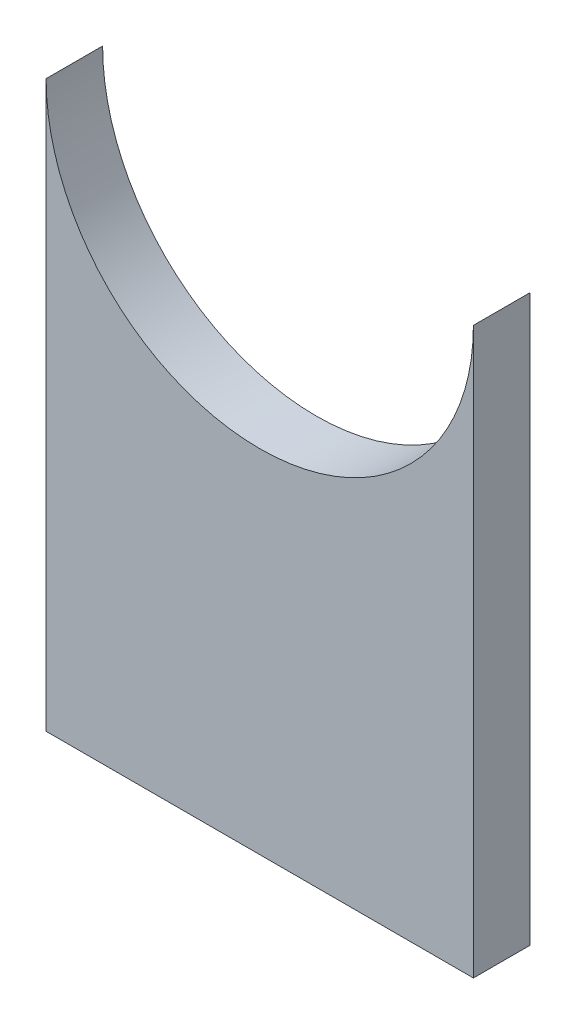
ISO-10303-21;
HEADER;
FILE_DESCRIPTION(('STEP AP214'),'2;1');
FILE_NAME('part.step','',(''),(''),'','','');
FILE_SCHEMA(('AUTOMOTIVE_DESIGN { 1 0 10303 214 1 1 1 1 }'));
ENDSEC;
DATA;
#1=APPLICATION_CONTEXT('core data for automotive mechanical design processes');
#2=APPLICATION_PROTOCOL_DEFINITION('international standard','automotive_design',2000,#1);
#3=PRODUCT_CONTEXT('',#1,'mechanical');
#4=PRODUCT('Part','Part','',(#3));
#5=PRODUCT_RELATED_PRODUCT_CATEGORY('part','',(#4));
#6=PRODUCT_DEFINITION_FORMATION('','',#4);
#7=PRODUCT_DEFINITION_CONTEXT('part definition',#1,'design');
#8=PRODUCT_DEFINITION('design','',#6,#7);
#9=PRODUCT_DEFINITION_SHAPE('','',#8);
#10=(LENGTH_UNIT() NAMED_UNIT(*) SI_UNIT(.MILLI.,.METRE.));
#11=(NAMED_UNIT(*) PLANE_ANGLE_UNIT() SI_UNIT($,.RADIAN.));
#12=(NAMED_UNIT(*) SI_UNIT($,.STERADIAN.) SOLID_ANGLE_UNIT());
#13=UNCERTAINTY_MEASURE_WITH_UNIT(LENGTH_MEASURE(1.E-05),#10,'distance_accuracy_value','');
#14=(GEOMETRIC_REPRESENTATION_CONTEXT(3) GLOBAL_UNCERTAINTY_ASSIGNED_CONTEXT((#13)) GLOBAL_UNIT_ASSIGNED_CONTEXT((#10,
#11,#12)) REPRESENTATION_CONTEXT('',''));
#15=CARTESIAN_POINT('',(0.,0.,0.));
#16=DIRECTION('',(0.,0.,1.));
#17=DIRECTION('',(1.,0.,0.));
#18=AXIS2_PLACEMENT_3D('',#15,#16,#17);
#19=CARTESIAN_POINT('',(0.,0.,6.35));
#20=DIRECTION('',(0.,0.,-1.));
#21=DIRECTION('',(-1.,0.,0.));
#22=AXIS2_PLACEMENT_3D('',#19,#20,#21);
#23=CYLINDRICAL_SURFACE('',#22,24.003);
#24=CARTESIAN_POINT('',(0.,0.,0.));
#25=DIRECTION('',(0.,0.,-1.));
#26=DIRECTION('',(1.,0.,0.));
#27=AXIS2_PLACEMENT_3D('',#24,#25,#26);
#28=CIRCLE('',#27,24.003);
#29=CARTESIAN_POINT('',(24.003,0.,0.));
#30=VERTEX_POINT('',#29);
#31=CARTESIAN_POINT('',(-24.003,0.,0.));
#32=VERTEX_POINT('',#31);
#33=EDGE_CURVE('E95',#30,#32,#28,.T.);
#34=ORIENTED_EDGE('',*,*,#33,.T.);
#35=DIRECTION('',(0.,0.,-1.));
#36=VECTOR('',#35,1.);
#37=CARTESIAN_POINT('',(-24.003,0.,6.35));
#38=LINE('',#37,#36);
#39=CARTESIAN_POINT('',(-24.003,0.,6.35));
#40=VERTEX_POINT('',#39);
#41=EDGE_CURVE('E11',#40,#32,#38,.T.);
#42=ORIENTED_EDGE('',*,*,#41,.F.);
#43=CARTESIAN_POINT('',(0.,0.,6.35));
#44=DIRECTION('',(0.,0.,-1.));
#45=DIRECTION('',(1.,0.,0.));
#46=AXIS2_PLACEMENT_3D('',#43,#44,#45);
#47=CIRCLE('',#46,24.003);
#48=CARTESIAN_POINT('',(24.003,0.,6.35));
#49=VERTEX_POINT('',#48);
#50=EDGE_CURVE('E83',#49,#40,#47,.T.);
#51=ORIENTED_EDGE('',*,*,#50,.F.);
#52=DIRECTION('',(0.,0.,-1.));
#53=VECTOR('',#52,1.);
#54=CARTESIAN_POINT('',(24.003,0.,6.35));
#55=LINE('',#54,#53);
#56=EDGE_CURVE('E91',#49,#30,#55,.T.);
#57=ORIENTED_EDGE('',*,*,#56,.T.);
#58=EDGE_LOOP('',(#34,#42,#51,#57));
#59=FACE_BOUND('',#58,.T.);
#60=ADVANCED_FACE('F32',(#59),#23,.F.);
#61=CARTESIAN_POINT('',(-24.003,-63.5,6.35));
#62=DIRECTION('',(1.,0.,0.));
#63=DIRECTION('',(0.,0.,-1.));
#64=AXIS2_PLACEMENT_3D('',#61,#62,#63);
#65=PLANE('',#64);
#66=DIRECTION('',(0.,-1.,0.));
#67=VECTOR('',#66,1.);
#68=CARTESIAN_POINT('',(-24.003,-63.5,0.));
#69=LINE('',#68,#67);
#70=CARTESIAN_POINT('',(-24.003,-63.5,0.));
#71=VERTEX_POINT('',#70);
#72=EDGE_CURVE('E87',#32,#71,#69,.T.);
#73=ORIENTED_EDGE('',*,*,#72,.T.);
#74=DIRECTION('',(0.,0.,-1.));
#75=VECTOR('',#74,1.);
#76=CARTESIAN_POINT('',(-24.003,-63.5,6.35));
#77=LINE('',#76,#75);
#78=CARTESIAN_POINT('',(-24.003,-63.5,6.35));
#79=VERTEX_POINT('',#78);
#80=EDGE_CURVE('E40',#79,#71,#77,.T.);
#81=ORIENTED_EDGE('',*,*,#80,.F.);
#82=DIRECTION('',(0.,-1.,0.));
#83=VECTOR('',#82,1.);
#84=CARTESIAN_POINT('',(-24.003,-63.5,6.35));
#85=LINE('',#84,#83);
#86=EDGE_CURVE('E78',#40,#79,#85,.T.);
#87=ORIENTED_EDGE('',*,*,#86,.F.);
#88=ORIENTED_EDGE('',*,*,#41,.T.);
#89=EDGE_LOOP('',(#73,#81,#87,#88));
#90=FACE_BOUND('',#89,.T.);
#91=ADVANCED_FACE('F86',(#90),#65,.F.);
#92=CARTESIAN_POINT('',(-24.003,-63.5,6.35));
#93=DIRECTION('',(0.,1.,0.));
#94=DIRECTION('',(0.,0.,1.));
#95=AXIS2_PLACEMENT_3D('',#92,#93,#94);
#96=PLANE('',#95);
#97=DIRECTION('',(1.,0.,0.));
#98=VECTOR('',#97,1.);
#99=CARTESIAN_POINT('',(-24.003,-63.5,0.));
#100=LINE('',#99,#98);
#101=CARTESIAN_POINT('',(24.003,-63.5,0.));
#102=VERTEX_POINT('',#101);
#103=EDGE_CURVE('E65',#71,#102,#100,.T.);
#104=ORIENTED_EDGE('',*,*,#103,.T.);
#105=DIRECTION('',(0.,0.,-1.));
#106=VECTOR('',#105,1.);
#107=CARTESIAN_POINT('',(24.003,-63.5,6.35));
#108=LINE('',#107,#106);
#109=CARTESIAN_POINT('',(24.003,-63.5,6.35));
#110=VERTEX_POINT('',#109);
#111=EDGE_CURVE('E88',#110,#102,#108,.T.);
#112=ORIENTED_EDGE('',*,*,#111,.F.);
#113=DIRECTION('',(1.,0.,0.));
#114=VECTOR('',#113,1.);
#115=CARTESIAN_POINT('',(-24.003,-63.5,6.35));
#116=LINE('',#115,#114);
#117=EDGE_CURVE('E81',#79,#110,#116,.T.);
#118=ORIENTED_EDGE('',*,*,#117,.F.);
#119=ORIENTED_EDGE('',*,*,#80,.T.);
#120=EDGE_LOOP('',(#104,#112,#118,#119));
#121=FACE_BOUND('',#120,.T.);
#122=ADVANCED_FACE('F89',(#121),#96,.F.);
#123=CARTESIAN_POINT('',(24.003,-63.5,6.35));
#124=DIRECTION('',(-1.,0.,0.));
#125=DIRECTION('',(0.,0.,1.));
#126=AXIS2_PLACEMENT_3D('',#123,#124,#125);
#127=PLANE('',#126);
#128=DIRECTION('',(0.,1.,0.));
#129=VECTOR('',#128,1.);
#130=CARTESIAN_POINT('',(24.003,-63.5,0.));
#131=LINE('',#130,#129);
#132=EDGE_CURVE('E71',#102,#30,#131,.T.);
#133=ORIENTED_EDGE('',*,*,#132,.T.);
#134=ORIENTED_EDGE('',*,*,#56,.F.);
#135=DIRECTION('',(0.,1.,0.));
#136=VECTOR('',#135,1.);
#137=CARTESIAN_POINT('',(24.003,-63.5,6.35));
#138=LINE('',#137,#136);
#139=EDGE_CURVE('E48',#110,#49,#138,.T.);
#140=ORIENTED_EDGE('',*,*,#139,.F.);
#141=ORIENTED_EDGE('',*,*,#111,.T.);
#142=EDGE_LOOP('',(#133,#134,#140,#141));
#143=FACE_BOUND('',#142,.T.);
#144=ADVANCED_FACE('F102',(#143),#127,.F.);
#145=CARTESIAN_POINT('',(0.,0.,6.35));
#146=DIRECTION('',(0.,0.,1.));
#147=DIRECTION('',(1.,0.,0.));
#148=AXIS2_PLACEMENT_3D('',#145,#146,#147);
#149=PLANE('',#148);
#150=ORIENTED_EDGE('',*,*,#50,.T.);
#151=ORIENTED_EDGE('',*,*,#86,.T.);
#152=ORIENTED_EDGE('',*,*,#117,.T.);
#153=ORIENTED_EDGE('',*,*,#139,.T.);
#154=EDGE_LOOP('',(#150,#151,#152,#153));
#155=FACE_BOUND('',#154,.T.);
#156=ADVANCED_FACE('F79',(#155),#149,.T.);
#157=CARTESIAN_POINT('',(0.,0.,0.));
#158=DIRECTION('',(0.,0.,1.));
#159=DIRECTION('',(1.,0.,0.));
#160=AXIS2_PLACEMENT_3D('',#157,#158,#159);
#161=PLANE('',#160);
#162=ORIENTED_EDGE('',*,*,#33,.F.);
#163=ORIENTED_EDGE('',*,*,#132,.F.);
#164=ORIENTED_EDGE('',*,*,#103,.F.);
#165=ORIENTED_EDGE('',*,*,#72,.F.);
#166=EDGE_LOOP('',(#162,#163,#164,#165));
#167=FACE_BOUND('',#166,.T.);
#168=ADVANCED_FACE('F105',(#167),#161,.F.);
#169=CLOSED_SHELL('',(#60,#91,#122,#144,#156,#168));
#170=MANIFOLD_SOLID_BREP('B2',#169);
#171=ADVANCED_BREP_SHAPE_REPRESENTATION('',(#18,#170),#14);
#172=SHAPE_DEFINITION_REPRESENTATION(#9,#171);
ENDSEC;
END-ISO-10303-21;
